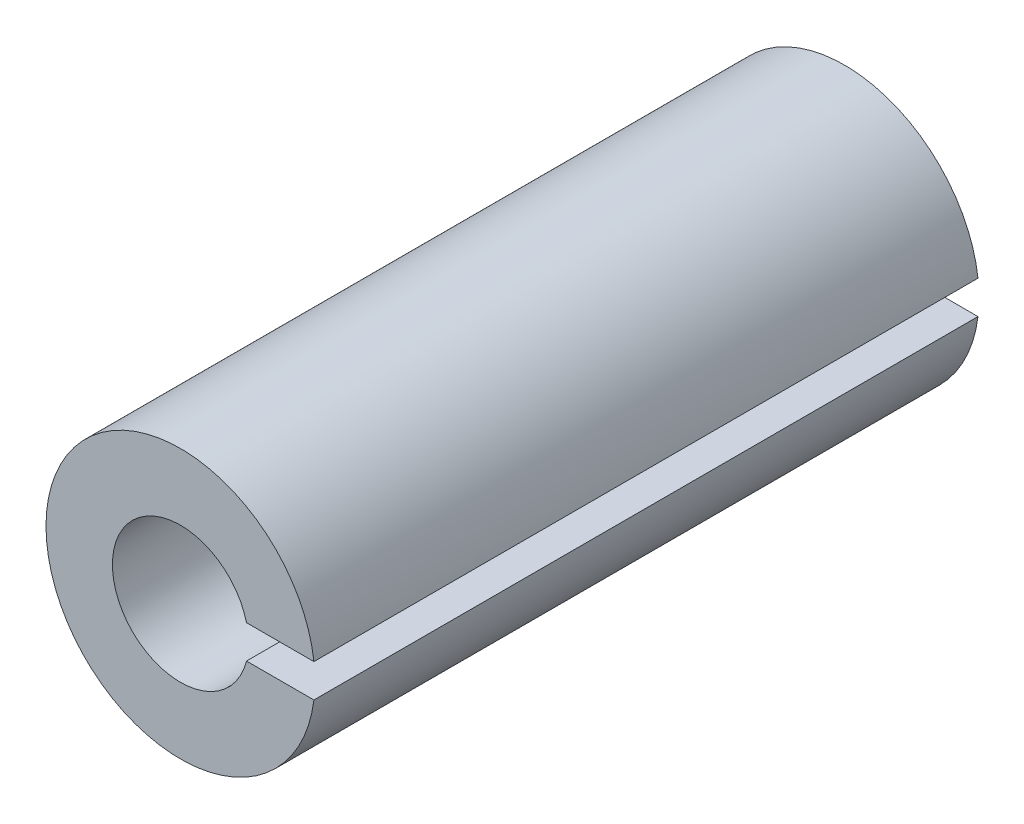
ISO-10303-21;
HEADER;
FILE_DESCRIPTION(('STEP AP214'),'2;1');
FILE_NAME('part.step','',(''),(''),'','','');
FILE_SCHEMA(('AUTOMOTIVE_DESIGN { 1 0 10303 214 1 1 1 1 }'));
ENDSEC;
DATA;
#1=APPLICATION_CONTEXT('core data for automotive mechanical design processes');
#2=APPLICATION_PROTOCOL_DEFINITION('international standard','automotive_design',2000,#1);
#3=PRODUCT_CONTEXT('',#1,'mechanical');
#4=PRODUCT('Part','Part','',(#3));
#5=PRODUCT_RELATED_PRODUCT_CATEGORY('part','',(#4));
#6=PRODUCT_DEFINITION_FORMATION('','',#4);
#7=PRODUCT_DEFINITION_CONTEXT('part definition',#1,'design');
#8=PRODUCT_DEFINITION('design','',#6,#7);
#9=PRODUCT_DEFINITION_SHAPE('','',#8);
#10=(LENGTH_UNIT() NAMED_UNIT(*) SI_UNIT(.MILLI.,.METRE.));
#11=(NAMED_UNIT(*) PLANE_ANGLE_UNIT() SI_UNIT($,.RADIAN.));
#12=(NAMED_UNIT(*) SI_UNIT($,.STERADIAN.) SOLID_ANGLE_UNIT());
#13=UNCERTAINTY_MEASURE_WITH_UNIT(LENGTH_MEASURE(1.E-05),#10,'distance_accuracy_value','');
#14=(GEOMETRIC_REPRESENTATION_CONTEXT(3) GLOBAL_UNCERTAINTY_ASSIGNED_CONTEXT((#13)) GLOBAL_UNIT_ASSIGNED_CONTEXT((#10,
#11,#12)) REPRESENTATION_CONTEXT('',''));
#15=CARTESIAN_POINT('',(0.,0.,0.));
#16=DIRECTION('',(0.,0.,1.));
#17=DIRECTION('',(1.,0.,0.));
#18=AXIS2_PLACEMENT_3D('',#15,#16,#17);
#19=CARTESIAN_POINT('',(0.,0.,20.));
#20=DIRECTION('',(0.,0.,1.));
#21=DIRECTION('',(1.,0.,0.));
#22=AXIS2_PLACEMENT_3D('',#19,#20,#21);
#23=PLANE('',#22);
#24=CARTESIAN_POINT('',(0.,0.,20.));
#25=DIRECTION('',(0.,0.,1.));
#26=DIRECTION('',(1.,0.,0.));
#27=AXIS2_PLACEMENT_3D('',#24,#25,#26);
#28=CIRCLE('',#27,4.05);
#29=CARTESIAN_POINT('',(4.01901729282172,0.5,20.));
#30=VERTEX_POINT('',#29);
#31=CARTESIAN_POINT('',(4.01901729282172,-0.5,20.));
#32=VERTEX_POINT('',#31);
#33=EDGE_CURVE('E92',#30,#32,#28,.T.);
#34=ORIENTED_EDGE('',*,*,#33,.T.);
#35=DIRECTION('',(-1.,0.,0.));
#36=VECTOR('',#35,1.);
#37=CARTESIAN_POINT('',(0.,-0.5,20.));
#38=LINE('',#37,#36);
#39=CARTESIAN_POINT('',(1.9880895352071,-0.5,20.));
#40=VERTEX_POINT('',#39);
#41=EDGE_CURVE('E74',#32,#40,#38,.T.);
#42=ORIENTED_EDGE('',*,*,#41,.T.);
#43=CARTESIAN_POINT('',(0.,0.,20.));
#44=DIRECTION('',(0.,0.,1.));
#45=DIRECTION('',(1.,0.,0.));
#46=AXIS2_PLACEMENT_3D('',#43,#44,#45);
#47=CIRCLE('',#46,2.05);
#48=CARTESIAN_POINT('',(1.9880895352071,0.5,20.));
#49=VERTEX_POINT('',#48);
#50=EDGE_CURVE('E93',#49,#40,#47,.T.);
#51=ORIENTED_EDGE('',*,*,#50,.F.);
#52=DIRECTION('',(-1.,0.,0.));
#53=VECTOR('',#52,1.);
#54=CARTESIAN_POINT('',(0.,0.5,20.));
#55=LINE('',#54,#53);
#56=EDGE_CURVE('E55',#30,#49,#55,.T.);
#57=ORIENTED_EDGE('',*,*,#56,.F.);
#58=EDGE_LOOP('',(#34,#42,#51,#57));
#59=FACE_BOUND('',#58,.T.);
#60=ADVANCED_FACE('F33',(#59),#23,.T.);
#61=CARTESIAN_POINT('',(0.,0.,0.));
#62=DIRECTION('',(0.,0.,1.));
#63=DIRECTION('',(1.,0.,0.));
#64=AXIS2_PLACEMENT_3D('',#61,#62,#63);
#65=PLANE('',#64);
#66=DIRECTION('',(1.,0.,0.));
#67=VECTOR('',#66,1.);
#68=CARTESIAN_POINT('',(0.,-0.5,0.));
#69=LINE('',#68,#67);
#70=CARTESIAN_POINT('',(1.9880895352071,-0.5,0.));
#71=VERTEX_POINT('',#70);
#72=CARTESIAN_POINT('',(4.01901729282172,-0.5,0.));
#73=VERTEX_POINT('',#72);
#74=EDGE_CURVE('E48',#71,#73,#69,.T.);
#75=ORIENTED_EDGE('',*,*,#74,.T.);
#76=CARTESIAN_POINT('',(0.,0.,0.));
#77=DIRECTION('',(0.,0.,1.));
#78=DIRECTION('',(1.,0.,0.));
#79=AXIS2_PLACEMENT_3D('',#76,#77,#78);
#80=CIRCLE('',#79,4.05);
#81=CARTESIAN_POINT('',(4.01901729282172,0.5,0.));
#82=VERTEX_POINT('',#81);
#83=EDGE_CURVE('E86',#82,#73,#80,.T.);
#84=ORIENTED_EDGE('',*,*,#83,.F.);
#85=DIRECTION('',(1.,0.,0.));
#86=VECTOR('',#85,1.);
#87=CARTESIAN_POINT('',(0.,0.5,0.));
#88=LINE('',#87,#86);
#89=CARTESIAN_POINT('',(1.9880895352071,0.5,0.));
#90=VERTEX_POINT('',#89);
#91=EDGE_CURVE('E88',#90,#82,#88,.T.);
#92=ORIENTED_EDGE('',*,*,#91,.F.);
#93=CARTESIAN_POINT('',(0.,0.,0.));
#94=DIRECTION('',(0.,0.,1.));
#95=DIRECTION('',(1.,0.,0.));
#96=AXIS2_PLACEMENT_3D('',#93,#94,#95);
#97=CIRCLE('',#96,2.05);
#98=EDGE_CURVE('E79',#90,#71,#97,.T.);
#99=ORIENTED_EDGE('',*,*,#98,.T.);
#100=EDGE_LOOP('',(#75,#84,#92,#99));
#101=FACE_BOUND('',#100,.T.);
#102=ADVANCED_FACE('F84',(#101),#65,.F.);
#103=CARTESIAN_POINT('',(0.,0.,20.));
#104=DIRECTION('',(0.,0.,-1.));
#105=DIRECTION('',(-1.,0.,0.));
#106=AXIS2_PLACEMENT_3D('',#103,#104,#105);
#107=CYLINDRICAL_SURFACE('',#106,4.05);
#108=DIRECTION('',(0.,0.,-1.));
#109=VECTOR('',#108,1.);
#110=CARTESIAN_POINT('',(4.01901729282172,-0.5,20.));
#111=LINE('',#110,#109);
#112=EDGE_CURVE('E71',#32,#73,#111,.T.);
#113=ORIENTED_EDGE('',*,*,#112,.F.);
#114=ORIENTED_EDGE('',*,*,#33,.F.);
#115=DIRECTION('',(0.,0.,-1.));
#116=VECTOR('',#115,1.);
#117=CARTESIAN_POINT('',(4.01901729282172,0.5,20.));
#118=LINE('',#117,#116);
#119=EDGE_CURVE('E91',#30,#82,#118,.T.);
#120=ORIENTED_EDGE('',*,*,#119,.T.);
#121=ORIENTED_EDGE('',*,*,#83,.T.);
#122=EDGE_LOOP('',(#113,#114,#120,#121));
#123=FACE_BOUND('',#122,.T.);
#124=ADVANCED_FACE('F35',(#123),#107,.T.);
#125=CARTESIAN_POINT('',(0.,0.,20.));
#126=DIRECTION('',(0.,0.,-1.));
#127=DIRECTION('',(-1.,0.,0.));
#128=AXIS2_PLACEMENT_3D('',#125,#126,#127);
#129=CYLINDRICAL_SURFACE('',#128,2.05);
#130=ORIENTED_EDGE('',*,*,#50,.T.);
#131=DIRECTION('',(0.,0.,-1.));
#132=VECTOR('',#131,1.);
#133=CARTESIAN_POINT('',(1.9880895352071,-0.5,20.));
#134=LINE('',#133,#132);
#135=EDGE_CURVE('E11',#40,#71,#134,.T.);
#136=ORIENTED_EDGE('',*,*,#135,.T.);
#137=ORIENTED_EDGE('',*,*,#98,.F.);
#138=DIRECTION('',(0.,0.,-1.));
#139=VECTOR('',#138,1.);
#140=CARTESIAN_POINT('',(1.9880895352071,0.5,20.));
#141=LINE('',#140,#139);
#142=EDGE_CURVE('E41',#49,#90,#141,.T.);
#143=ORIENTED_EDGE('',*,*,#142,.F.);
#144=EDGE_LOOP('',(#130,#136,#137,#143));
#145=FACE_BOUND('',#144,.T.);
#146=ADVANCED_FACE('F103',(#145),#129,.F.);
#147=CARTESIAN_POINT('',(0.,0.5,20.000012));
#148=DIRECTION('',(0.,1.,0.));
#149=DIRECTION('',(0.,0.,1.));
#150=AXIS2_PLACEMENT_3D('',#147,#148,#149);
#151=PLANE('',#150);
#152=ORIENTED_EDGE('',*,*,#56,.T.);
#153=ORIENTED_EDGE('',*,*,#142,.T.);
#154=ORIENTED_EDGE('',*,*,#91,.T.);
#155=ORIENTED_EDGE('',*,*,#119,.F.);
#156=EDGE_LOOP('',(#152,#153,#154,#155));
#157=FACE_BOUND('',#156,.T.);
#158=ADVANCED_FACE('F99',(#157),#151,.F.);
#159=CARTESIAN_POINT('',(0.,-0.5,20.000012));
#160=DIRECTION('',(0.,1.,0.));
#161=DIRECTION('',(0.,0.,1.));
#162=AXIS2_PLACEMENT_3D('',#159,#160,#161);
#163=PLANE('',#162);
#164=ORIENTED_EDGE('',*,*,#112,.T.);
#165=ORIENTED_EDGE('',*,*,#74,.F.);
#166=ORIENTED_EDGE('',*,*,#135,.F.);
#167=ORIENTED_EDGE('',*,*,#41,.F.);
#168=EDGE_LOOP('',(#164,#165,#166,#167));
#169=FACE_BOUND('',#168,.T.);
#170=ADVANCED_FACE('F72',(#169),#163,.T.);
#171=CLOSED_SHELL('',(#60,#102,#124,#146,#158,#170));
#172=MANIFOLD_SOLID_BREP('B2',#171);
#173=ADVANCED_BREP_SHAPE_REPRESENTATION('',(#18,#172),#14);
#174=SHAPE_DEFINITION_REPRESENTATION(#9,#173);
ENDSEC;
END-ISO-10303-21;
